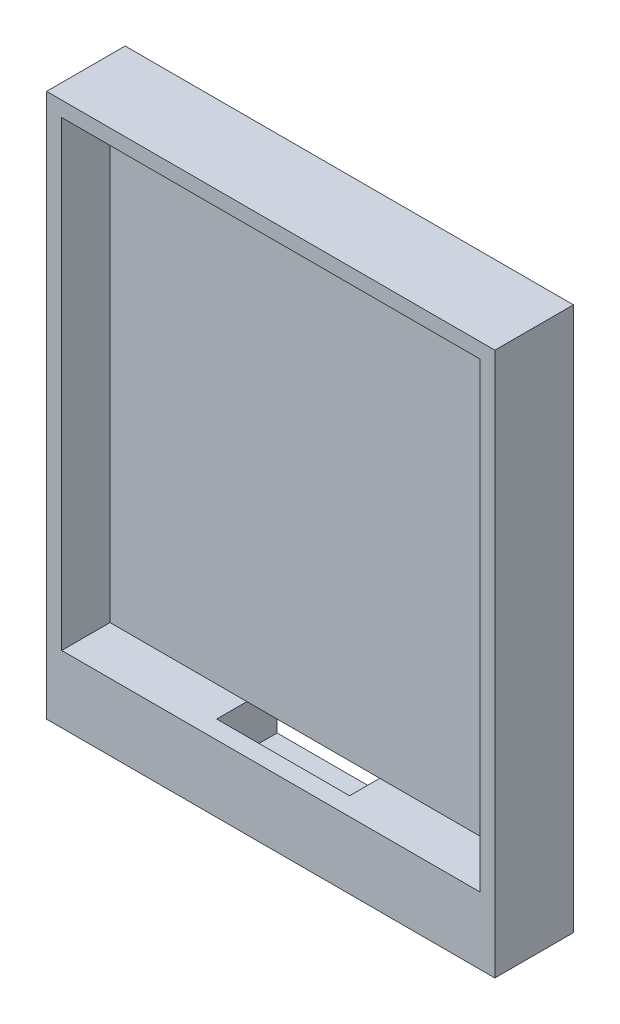
ISO-10303-21;
HEADER;
FILE_DESCRIPTION(('STEP AP214'),'2;1');
FILE_NAME('part.step','',(''),(''),'','','');
FILE_SCHEMA(('AUTOMOTIVE_DESIGN { 1 0 10303 214 1 1 1 1 }'));
ENDSEC;
DATA;
#1=APPLICATION_CONTEXT('core data for automotive mechanical design processes');
#2=APPLICATION_PROTOCOL_DEFINITION('international standard','automotive_design',2000,#1);
#3=PRODUCT_CONTEXT('',#1,'mechanical');
#4=PRODUCT('Part','Part','',(#3));
#5=PRODUCT_RELATED_PRODUCT_CATEGORY('part','',(#4));
#6=PRODUCT_DEFINITION_FORMATION('','',#4);
#7=PRODUCT_DEFINITION_CONTEXT('part definition',#1,'design');
#8=PRODUCT_DEFINITION('design','',#6,#7);
#9=PRODUCT_DEFINITION_SHAPE('','',#8);
#10=(LENGTH_UNIT() NAMED_UNIT(*) SI_UNIT(.MILLI.,.METRE.));
#11=(NAMED_UNIT(*) PLANE_ANGLE_UNIT() SI_UNIT($,.RADIAN.));
#12=(NAMED_UNIT(*) SI_UNIT($,.STERADIAN.) SOLID_ANGLE_UNIT());
#13=UNCERTAINTY_MEASURE_WITH_UNIT(LENGTH_MEASURE(1.E-05),#10,'distance_accuracy_value','');
#14=(GEOMETRIC_REPRESENTATION_CONTEXT(3) GLOBAL_UNCERTAINTY_ASSIGNED_CONTEXT((#13)) GLOBAL_UNIT_ASSIGNED_CONTEXT((#10,
#11,#12)) REPRESENTATION_CONTEXT('',''));
#15=CARTESIAN_POINT('',(0.,0.,0.));
#16=DIRECTION('',(0.,0.,1.));
#17=DIRECTION('',(1.,0.,0.));
#18=AXIS2_PLACEMENT_3D('',#15,#16,#17);
#19=CARTESIAN_POINT('',(0.,0.,0.));
#20=DIRECTION('',(0.,0.,-1.));
#21=DIRECTION('',(-1.,0.,0.));
#22=AXIS2_PLACEMENT_3D('',#19,#20,#21);
#23=PLANE('',#22);
#24=DIRECTION('',(1.,0.,0.));
#25=VECTOR('',#24,1.);
#26=CARTESIAN_POINT('',(-11.,-52.6084033613445,0.));
#27=LINE('',#26,#25);
#28=CARTESIAN_POINT('',(-11.,-52.6084033613445,0.));
#29=VERTEX_POINT('',#28);
#30=CARTESIAN_POINT('',(11.,-52.6084033613445,0.));
#31=VERTEX_POINT('',#30);
#32=EDGE_CURVE('E180',#29,#31,#27,.T.);
#33=ORIENTED_EDGE('',*,*,#32,.F.);
#34=DIRECTION('',(0.,1.,0.));
#35=VECTOR('',#34,1.);
#36=CARTESIAN_POINT('',(-11.,-53.6084033613445,0.));
#37=LINE('',#36,#35);
#38=CARTESIAN_POINT('',(-11.,-53.6084033613445,0.));
#39=VERTEX_POINT('',#38);
#40=EDGE_CURVE('E160',#39,#29,#37,.T.);
#41=ORIENTED_EDGE('',*,*,#40,.F.);
#42=DIRECTION('',(-1.,0.,0.));
#43=VECTOR('',#42,1.);
#44=CARTESIAN_POINT('',(11.,-53.6084033613445,0.));
#45=LINE('',#44,#43);
#46=CARTESIAN_POINT('',(11.,-53.6084033613445,0.));
#47=VERTEX_POINT('',#46);
#48=EDGE_CURVE('E210',#47,#39,#45,.T.);
#49=ORIENTED_EDGE('',*,*,#48,.F.);
#50=DIRECTION('',(0.,1.,0.));
#51=VECTOR('',#50,1.);
#52=CARTESIAN_POINT('',(11.,-53.6084033613445,0.));
#53=LINE('',#52,#51);
#54=EDGE_CURVE('E227',#47,#31,#53,.T.);
#55=ORIENTED_EDGE('',*,*,#54,.T.);
#56=EDGE_LOOP('',(#33,#41,#49,#55));
#57=FACE_BOUND('',#56,.T.);
#58=ADVANCED_FACE('F44',(#57),#23,.F.);
#59=DIRECTION('',(-1.,0.,0.));
#60=VECTOR('',#59,1.);
#61=CARTESIAN_POINT('',(-11.,-45.6084033613445,0.));
#62=LINE('',#61,#60);
#63=CARTESIAN_POINT('',(11.,-45.6084033613445,0.));
#64=VERTEX_POINT('',#63);
#65=CARTESIAN_POINT('',(-11.,-45.6084033613445,0.));
#66=VERTEX_POINT('',#65);
#67=EDGE_CURVE('E177',#64,#66,#62,.T.);
#68=ORIENTED_EDGE('',*,*,#67,.F.);
#69=DIRECTION('',(1.,0.,0.));
#70=VECTOR('',#69,1.);
#71=CARTESIAN_POINT('',(-33.6550420168067,-45.6084033613445,0.));
#72=LINE('',#71,#70);
#73=CARTESIAN_POINT('',(35.5449579831933,-45.6084033613445,0.));
#74=VERTEX_POINT('',#73);
#75=EDGE_CURVE('E270',#64,#74,#72,.T.);
#76=ORIENTED_EDGE('',*,*,#75,.T.);
#77=DIRECTION('',(0.,1.,0.));
#78=VECTOR('',#77,1.);
#79=CARTESIAN_POINT('',(35.5449579831933,30.7915966386555,0.));
#80=LINE('',#79,#78);
#81=CARTESIAN_POINT('',(35.5449579831933,30.7915966386555,0.));
#82=VERTEX_POINT('',#81);
#83=EDGE_CURVE('E275',#74,#82,#80,.T.);
#84=ORIENTED_EDGE('',*,*,#83,.T.);
#85=DIRECTION('',(-1.,0.,0.));
#86=VECTOR('',#85,1.);
#87=CARTESIAN_POINT('',(-33.6550420168067,30.7915966386555,0.));
#88=LINE('',#87,#86);
#89=CARTESIAN_POINT('',(-33.6550420168067,30.7915966386555,0.));
#90=VERTEX_POINT('',#89);
#91=EDGE_CURVE('E256',#82,#90,#88,.T.);
#92=ORIENTED_EDGE('',*,*,#91,.T.);
#93=DIRECTION('',(0.,-1.,0.));
#94=VECTOR('',#93,1.);
#95=CARTESIAN_POINT('',(-33.6550420168067,30.7915966386555,0.));
#96=LINE('',#95,#94);
#97=CARTESIAN_POINT('',(-33.6550420168067,-45.6084033613445,0.));
#98=VERTEX_POINT('',#97);
#99=EDGE_CURVE('E251',#90,#98,#96,.T.);
#100=ORIENTED_EDGE('',*,*,#99,.T.);
#101=EDGE_CURVE('E271',#98,#66,#72,.T.);
#102=ORIENTED_EDGE('',*,*,#101,.T.);
#103=EDGE_LOOP('',(#68,#76,#84,#92,#100,#102));
#104=FACE_BOUND('',#103,.T.);
#105=ADVANCED_FACE('F340',(#104),#23,.F.);
#106=CARTESIAN_POINT('',(0.,0.,8.));
#107=DIRECTION('',(0.,0.,1.));
#108=DIRECTION('',(1.,0.,0.));
#109=AXIS2_PLACEMENT_3D('',#106,#107,#108);
#110=PLANE('',#109);
#111=DIRECTION('',(0.,-1.,0.));
#112=VECTOR('',#111,1.);
#113=CARTESIAN_POINT('',(-36.1550420168067,33.2915966386555,8.));
#114=LINE('',#113,#112);
#115=CARTESIAN_POINT('',(-36.1550420168067,33.2915966386555,8.));
#116=VERTEX_POINT('',#115);
#117=CARTESIAN_POINT('',(-36.1550420168067,-56.7084033613445,8.));
#118=VERTEX_POINT('',#117);
#119=EDGE_CURVE('E295',#116,#118,#114,.T.);
#120=ORIENTED_EDGE('',*,*,#119,.T.);
#121=DIRECTION('',(1.,0.,0.));
#122=VECTOR('',#121,1.);
#123=CARTESIAN_POINT('',(-36.1550420168067,-56.7084033613445,8.));
#124=LINE('',#123,#122);
#125=CARTESIAN_POINT('',(38.0449579831933,-56.7084033613445,8.));
#126=VERTEX_POINT('',#125);
#127=EDGE_CURVE('E299',#118,#126,#124,.T.);
#128=ORIENTED_EDGE('',*,*,#127,.T.);
#129=DIRECTION('',(0.,1.,0.));
#130=VECTOR('',#129,1.);
#131=CARTESIAN_POINT('',(38.0449579831933,33.2915966386555,8.));
#132=LINE('',#131,#130);
#133=CARTESIAN_POINT('',(38.0449579831933,33.2915966386555,8.));
#134=VERTEX_POINT('',#133);
#135=EDGE_CURVE('E302',#126,#134,#132,.T.);
#136=ORIENTED_EDGE('',*,*,#135,.T.);
#137=DIRECTION('',(-1.,0.,0.));
#138=VECTOR('',#137,1.);
#139=CARTESIAN_POINT('',(-36.1550420168067,33.2915966386555,8.));
#140=LINE('',#139,#138);
#141=EDGE_CURVE('E305',#134,#116,#140,.T.);
#142=ORIENTED_EDGE('',*,*,#141,.T.);
#143=EDGE_LOOP('',(#120,#128,#136,#142));
#144=FACE_BOUND('',#143,.T.);
#145=DIRECTION('',(1.,0.,0.));
#146=VECTOR('',#145,1.);
#147=CARTESIAN_POINT('',(-33.6550420168067,-45.6084033613445,8.));
#148=LINE('',#147,#146);
#149=CARTESIAN_POINT('',(-33.6550420168067,-45.6084033613445,8.));
#150=VERTEX_POINT('',#149);
#151=CARTESIAN_POINT('',(35.5449579831933,-45.6084033613445,8.));
#152=VERTEX_POINT('',#151);
#153=EDGE_CURVE('E255',#150,#152,#148,.T.);
#154=ORIENTED_EDGE('',*,*,#153,.F.);
#155=DIRECTION('',(0.,-1.,0.));
#156=VECTOR('',#155,1.);
#157=CARTESIAN_POINT('',(-33.6550420168067,30.7915966386555,8.));
#158=LINE('',#157,#156);
#159=CARTESIAN_POINT('',(-33.6550420168067,30.7915966386555,8.));
#160=VERTEX_POINT('',#159);
#161=EDGE_CURVE('E252',#160,#150,#158,.T.);
#162=ORIENTED_EDGE('',*,*,#161,.F.);
#163=DIRECTION('',(-1.,0.,0.));
#164=VECTOR('',#163,1.);
#165=CARTESIAN_POINT('',(-33.6550420168067,30.7915966386555,8.));
#166=LINE('',#165,#164);
#167=CARTESIAN_POINT('',(35.5449579831933,30.7915966386555,8.));
#168=VERTEX_POINT('',#167);
#169=EDGE_CURVE('E263',#168,#160,#166,.T.);
#170=ORIENTED_EDGE('',*,*,#169,.F.);
#171=DIRECTION('',(0.,1.,0.));
#172=VECTOR('',#171,1.);
#173=CARTESIAN_POINT('',(35.5449579831933,30.7915966386555,8.));
#174=LINE('',#173,#172);
#175=EDGE_CURVE('E259',#152,#168,#174,.T.);
#176=ORIENTED_EDGE('',*,*,#175,.F.);
#177=EDGE_LOOP('',(#154,#162,#170,#176));
#178=FACE_BOUND('',#177,.T.);
#179=ADVANCED_FACE('F332',(#144,#178),#110,.T.);
#180=CARTESIAN_POINT('',(-36.1550420168067,33.2915966386555,8.));
#181=DIRECTION('',(1.,0.,0.));
#182=DIRECTION('',(0.,1.,0.));
#183=AXIS2_PLACEMENT_3D('',#180,#181,#182);
#184=PLANE('',#183);
#185=DIRECTION('',(0.,0.,-1.));
#186=VECTOR('',#185,1.);
#187=CARTESIAN_POINT('',(-36.1550420168067,33.2915966386555,8.));
#188=LINE('',#187,#186);
#189=CARTESIAN_POINT('',(-36.1550420168067,33.2915966386555,-5.));
#190=VERTEX_POINT('',#189);
#191=EDGE_CURVE('E308',#116,#190,#188,.T.);
#192=ORIENTED_EDGE('',*,*,#191,.T.);
#193=DIRECTION('',(0.,1.,0.));
#194=VECTOR('',#193,1.);
#195=CARTESIAN_POINT('',(-36.1550420168067,33.2915966386555,-5.));
#196=LINE('',#195,#194);
#197=CARTESIAN_POINT('',(-36.1550420168067,-56.7084033613445,-5.));
#198=VERTEX_POINT('',#197);
#199=EDGE_CURVE('E243',#198,#190,#196,.T.);
#200=ORIENTED_EDGE('',*,*,#199,.F.);
#201=DIRECTION('',(0.,0.,-1.));
#202=VECTOR('',#201,1.);
#203=CARTESIAN_POINT('',(-36.1550420168067,-56.7084033613445,8.));
#204=LINE('',#203,#202);
#205=EDGE_CURVE('E11',#118,#198,#204,.T.);
#206=ORIENTED_EDGE('',*,*,#205,.F.);
#207=ORIENTED_EDGE('',*,*,#119,.F.);
#208=EDGE_LOOP('',(#192,#200,#206,#207));
#209=FACE_BOUND('',#208,.T.);
#210=ADVANCED_FACE('F46',(#209),#184,.F.);
#211=CARTESIAN_POINT('',(-36.1550420168067,-56.7084033613445,8.));
#212=DIRECTION('',(0.,1.,0.));
#213=DIRECTION('',(0.,0.,1.));
#214=AXIS2_PLACEMENT_3D('',#211,#212,#213);
#215=PLANE('',#214);
#216=ORIENTED_EDGE('',*,*,#205,.T.);
#217=DIRECTION('',(-1.,0.,0.));
#218=VECTOR('',#217,1.);
#219=CARTESIAN_POINT('',(38.0449579831933,-56.7084033613445,-5.));
#220=LINE('',#219,#218);
#221=CARTESIAN_POINT('',(38.0449579831933,-56.7084033613445,-5.));
#222=VERTEX_POINT('',#221);
#223=EDGE_CURVE('E239',#222,#198,#220,.T.);
#224=ORIENTED_EDGE('',*,*,#223,.F.);
#225=DIRECTION('',(0.,0.,-1.));
#226=VECTOR('',#225,1.);
#227=CARTESIAN_POINT('',(38.0449579831933,-56.7084033613445,8.));
#228=LINE('',#227,#226);
#229=EDGE_CURVE('E53',#126,#222,#228,.T.);
#230=ORIENTED_EDGE('',*,*,#229,.F.);
#231=ORIENTED_EDGE('',*,*,#127,.F.);
#232=EDGE_LOOP('',(#216,#224,#230,#231));
#233=FACE_BOUND('',#232,.T.);
#234=ADVANCED_FACE('F322',(#233),#215,.F.);
#235=CARTESIAN_POINT('',(38.0449579831933,33.2915966386555,8.));
#236=DIRECTION('',(-1.,0.,0.));
#237=DIRECTION('',(0.,-1.,0.));
#238=AXIS2_PLACEMENT_3D('',#235,#236,#237);
#239=PLANE('',#238);
#240=ORIENTED_EDGE('',*,*,#229,.T.);
#241=DIRECTION('',(0.,-1.,0.));
#242=VECTOR('',#241,1.);
#243=CARTESIAN_POINT('',(38.0449579831933,33.2915966386555,-5.));
#244=LINE('',#243,#242);
#245=CARTESIAN_POINT('',(38.0449579831933,33.2915966386555,-5.));
#246=VERTEX_POINT('',#245);
#247=EDGE_CURVE('E226',#246,#222,#244,.T.);
#248=ORIENTED_EDGE('',*,*,#247,.F.);
#249=DIRECTION('',(0.,0.,-1.));
#250=VECTOR('',#249,1.);
#251=CARTESIAN_POINT('',(38.0449579831933,33.2915966386555,8.));
#252=LINE('',#251,#250);
#253=EDGE_CURVE('E311',#134,#246,#252,.T.);
#254=ORIENTED_EDGE('',*,*,#253,.F.);
#255=ORIENTED_EDGE('',*,*,#135,.F.);
#256=EDGE_LOOP('',(#240,#248,#254,#255));
#257=FACE_BOUND('',#256,.T.);
#258=ADVANCED_FACE('F319',(#257),#239,.F.);
#259=CARTESIAN_POINT('',(-36.1550420168067,33.2915966386555,8.));
#260=DIRECTION('',(0.,-1.,0.));
#261=DIRECTION('',(0.,0.,-1.));
#262=AXIS2_PLACEMENT_3D('',#259,#260,#261);
#263=PLANE('',#262);
#264=ORIENTED_EDGE('',*,*,#253,.T.);
#265=DIRECTION('',(1.,0.,0.));
#266=VECTOR('',#265,1.);
#267=CARTESIAN_POINT('',(38.0449579831933,33.2915966386555,-5.));
#268=LINE('',#267,#266);
#269=EDGE_CURVE('E247',#190,#246,#268,.T.);
#270=ORIENTED_EDGE('',*,*,#269,.F.);
#271=ORIENTED_EDGE('',*,*,#191,.F.);
#272=ORIENTED_EDGE('',*,*,#141,.F.);
#273=EDGE_LOOP('',(#264,#270,#271,#272));
#274=FACE_BOUND('',#273,.T.);
#275=ADVANCED_FACE('F328',(#274),#263,.F.);
#276=CARTESIAN_POINT('',(-33.6550420168067,30.7915966386555,8.));
#277=DIRECTION('',(1.,0.,0.));
#278=DIRECTION('',(0.,1.,0.));
#279=AXIS2_PLACEMENT_3D('',#276,#277,#278);
#280=PLANE('',#279);
#281=ORIENTED_EDGE('',*,*,#99,.F.);
#282=DIRECTION('',(0.,0.,-1.));
#283=VECTOR('',#282,1.);
#284=CARTESIAN_POINT('',(-33.6550420168067,30.7915966386555,8.));
#285=LINE('',#284,#283);
#286=EDGE_CURVE('E266',#160,#90,#285,.T.);
#287=ORIENTED_EDGE('',*,*,#286,.F.);
#288=ORIENTED_EDGE('',*,*,#161,.T.);
#289=DIRECTION('',(0.,0.,-1.));
#290=VECTOR('',#289,1.);
#291=CARTESIAN_POINT('',(-33.6550420168067,-45.6084033613445,8.));
#292=LINE('',#291,#290);
#293=EDGE_CURVE('E291',#150,#98,#292,.T.);
#294=ORIENTED_EDGE('',*,*,#293,.T.);
#295=EDGE_LOOP('',(#281,#287,#288,#294));
#296=FACE_BOUND('',#295,.T.);
#297=ADVANCED_FACE('F364',(#296),#280,.T.);
#298=CARTESIAN_POINT('',(-33.6550420168067,-45.6084033613445,8.));
#299=DIRECTION('',(0.,1.,0.));
#300=DIRECTION('',(-1.,0.,0.));
#301=AXIS2_PLACEMENT_3D('',#298,#299,#300);
#302=PLANE('',#301);
#303=DIRECTION('',(0.,0.,1.));
#304=VECTOR('',#303,1.);
#305=CARTESIAN_POINT('',(-11.,-45.6084033613445,0.));
#306=LINE('',#305,#304);
#307=CARTESIAN_POINT('',(-11.,-45.6084033613445,5.));
#308=VERTEX_POINT('',#307);
#309=EDGE_CURVE('E192',#66,#308,#306,.T.);
#310=ORIENTED_EDGE('',*,*,#309,.F.);
#311=ORIENTED_EDGE('',*,*,#101,.F.);
#312=ORIENTED_EDGE('',*,*,#293,.F.);
#313=ORIENTED_EDGE('',*,*,#153,.T.);
#314=DIRECTION('',(0.,0.,-1.));
#315=VECTOR('',#314,1.);
#316=CARTESIAN_POINT('',(35.5449579831933,-45.6084033613445,8.));
#317=LINE('',#316,#315);
#318=EDGE_CURVE('E287',#152,#74,#317,.T.);
#319=ORIENTED_EDGE('',*,*,#318,.T.);
#320=ORIENTED_EDGE('',*,*,#75,.F.);
#321=DIRECTION('',(0.,0.,-1.));
#322=VECTOR('',#321,1.);
#323=CARTESIAN_POINT('',(11.,-45.6084033613445,0.));
#324=LINE('',#323,#322);
#325=CARTESIAN_POINT('',(11.,-45.6084033613445,5.));
#326=VERTEX_POINT('',#325);
#327=EDGE_CURVE('E202',#326,#64,#324,.T.);
#328=ORIENTED_EDGE('',*,*,#327,.F.);
#329=DIRECTION('',(1.,0.,0.));
#330=VECTOR('',#329,1.);
#331=CARTESIAN_POINT('',(11.,-45.6084033613445,5.));
#332=LINE('',#331,#330);
#333=EDGE_CURVE('E217',#308,#326,#332,.T.);
#334=ORIENTED_EDGE('',*,*,#333,.F.);
#335=EDGE_LOOP('',(#310,#311,#312,#313,#319,#320,#328,#334));
#336=FACE_BOUND('',#335,.T.);
#337=ADVANCED_FACE('F360',(#336),#302,.T.);
#338=CARTESIAN_POINT('',(35.5449579831933,30.7915966386555,8.));
#339=DIRECTION('',(-1.,0.,0.));
#340=DIRECTION('',(0.,0.,1.));
#341=AXIS2_PLACEMENT_3D('',#338,#339,#340);
#342=PLANE('',#341);
#343=ORIENTED_EDGE('',*,*,#83,.F.);
#344=ORIENTED_EDGE('',*,*,#318,.F.);
#345=ORIENTED_EDGE('',*,*,#175,.T.);
#346=DIRECTION('',(0.,0.,-1.));
#347=VECTOR('',#346,1.);
#348=CARTESIAN_POINT('',(35.5449579831933,30.7915966386555,8.));
#349=LINE('',#348,#347);
#350=EDGE_CURVE('E284',#168,#82,#349,.T.);
#351=ORIENTED_EDGE('',*,*,#350,.T.);
#352=EDGE_LOOP('',(#343,#344,#345,#351));
#353=FACE_BOUND('',#352,.T.);
#354=ADVANCED_FACE('F356',(#353),#342,.T.);
#355=CARTESIAN_POINT('',(-33.6550420168067,30.7915966386555,8.));
#356=DIRECTION('',(0.,-1.,0.));
#357=DIRECTION('',(0.,0.,-1.));
#358=AXIS2_PLACEMENT_3D('',#355,#356,#357);
#359=PLANE('',#358);
#360=ORIENTED_EDGE('',*,*,#91,.F.);
#361=ORIENTED_EDGE('',*,*,#350,.F.);
#362=ORIENTED_EDGE('',*,*,#169,.T.);
#363=ORIENTED_EDGE('',*,*,#286,.T.);
#364=EDGE_LOOP('',(#360,#361,#362,#363));
#365=FACE_BOUND('',#364,.T.);
#366=ADVANCED_FACE('F353',(#365),#359,.T.);
#367=CARTESIAN_POINT('',(0.,0.,-5.));
#368=DIRECTION('',(0.,0.,-1.));
#369=DIRECTION('',(-1.,0.,0.));
#370=AXIS2_PLACEMENT_3D('',#367,#368,#369);
#371=PLANE('',#370);
#372=DIRECTION('',(0.,-1.,0.));
#373=VECTOR('',#372,1.);
#374=CARTESIAN_POINT('',(-11.,-45.6084033613445,-5.));
#375=LINE('',#374,#373);
#376=CARTESIAN_POINT('',(-11.,-45.6084033613445,-5.));
#377=VERTEX_POINT('',#376);
#378=CARTESIAN_POINT('',(-11.,-52.6084033613445,-5.));
#379=VERTEX_POINT('',#378);
#380=EDGE_CURVE('E157',#377,#379,#375,.T.);
#381=ORIENTED_EDGE('',*,*,#380,.T.);
#382=DIRECTION('',(1.,0.,0.));
#383=VECTOR('',#382,1.);
#384=CARTESIAN_POINT('',(-11.,-52.6084033613445,-5.));
#385=LINE('',#384,#383);
#386=CARTESIAN_POINT('',(11.,-52.6084033613445,-5.));
#387=VERTEX_POINT('',#386);
#388=EDGE_CURVE('E169',#379,#387,#385,.T.);
#389=ORIENTED_EDGE('',*,*,#388,.T.);
#390=DIRECTION('',(0.,1.,0.));
#391=VECTOR('',#390,1.);
#392=CARTESIAN_POINT('',(11.,-45.6084033613445,-5.));
#393=LINE('',#392,#391);
#394=CARTESIAN_POINT('',(11.,-45.6084033613445,-5.));
#395=VERTEX_POINT('',#394);
#396=EDGE_CURVE('E60',#387,#395,#393,.T.);
#397=ORIENTED_EDGE('',*,*,#396,.T.);
#398=DIRECTION('',(-1.,0.,0.));
#399=VECTOR('',#398,1.);
#400=CARTESIAN_POINT('',(-11.,-45.6084033613445,-5.));
#401=LINE('',#400,#399);
#402=EDGE_CURVE('E166',#395,#377,#401,.T.);
#403=ORIENTED_EDGE('',*,*,#402,.T.);
#404=EDGE_LOOP('',(#381,#389,#397,#403));
#405=FACE_BOUND('',#404,.T.);
#406=ORIENTED_EDGE('',*,*,#247,.T.);
#407=ORIENTED_EDGE('',*,*,#223,.T.);
#408=ORIENTED_EDGE('',*,*,#199,.T.);
#409=ORIENTED_EDGE('',*,*,#269,.T.);
#410=EDGE_LOOP('',(#406,#407,#408,#409));
#411=FACE_BOUND('',#410,.T.);
#412=ADVANCED_FACE('F174',(#405,#411),#371,.T.);
#413=CARTESIAN_POINT('',(-11.,-53.6084033613445,0.));
#414=DIRECTION('',(-1.,0.,0.));
#415=DIRECTION('',(0.,-1.,0.));
#416=AXIS2_PLACEMENT_3D('',#413,#414,#415);
#417=PLANE('',#416);
#418=ORIENTED_EDGE('',*,*,#309,.T.);
#419=DIRECTION('',(0.,1.,0.));
#420=VECTOR('',#419,1.);
#421=CARTESIAN_POINT('',(-11.,-53.6084033613445,5.));
#422=LINE('',#421,#420);
#423=CARTESIAN_POINT('',(-11.,-53.6084033613445,5.));
#424=VERTEX_POINT('',#423);
#425=EDGE_CURVE('E214',#424,#308,#422,.T.);
#426=ORIENTED_EDGE('',*,*,#425,.F.);
#427=DIRECTION('',(0.,0.,1.));
#428=VECTOR('',#427,1.);
#429=CARTESIAN_POINT('',(-11.,-53.6084033613445,0.));
#430=LINE('',#429,#428);
#431=EDGE_CURVE('E197',#39,#424,#430,.T.);
#432=ORIENTED_EDGE('',*,*,#431,.F.);
#433=ORIENTED_EDGE('',*,*,#40,.T.);
#434=DIRECTION('',(0.,0.,1.));
#435=VECTOR('',#434,1.);
#436=CARTESIAN_POINT('',(-11.,-52.6084033613445,-5.));
#437=LINE('',#436,#435);
#438=EDGE_CURVE('E152',#379,#29,#437,.T.);
#439=ORIENTED_EDGE('',*,*,#438,.F.);
#440=ORIENTED_EDGE('',*,*,#380,.F.);
#441=DIRECTION('',(0.,0.,1.));
#442=VECTOR('',#441,1.);
#443=CARTESIAN_POINT('',(-11.,-45.6084033613445,-5.));
#444=LINE('',#443,#442);
#445=EDGE_CURVE('E189',#377,#66,#444,.T.);
#446=ORIENTED_EDGE('',*,*,#445,.T.);
#447=EDGE_LOOP('',(#418,#426,#432,#433,#439,#440,#446));
#448=FACE_BOUND('',#447,.T.);
#449=ADVANCED_FACE('F155',(#448),#417,.F.);
#450=CARTESIAN_POINT('',(11.,-53.6084033613445,0.));
#451=DIRECTION('',(1.,0.,0.));
#452=DIRECTION('',(0.,1.,0.));
#453=AXIS2_PLACEMENT_3D('',#450,#451,#452);
#454=PLANE('',#453);
#455=ORIENTED_EDGE('',*,*,#327,.T.);
#456=DIRECTION('',(0.,0.,1.));
#457=VECTOR('',#456,1.);
#458=CARTESIAN_POINT('',(11.,-45.6084033613445,-5.));
#459=LINE('',#458,#457);
#460=EDGE_CURVE('E67',#395,#64,#459,.T.);
#461=ORIENTED_EDGE('',*,*,#460,.F.);
#462=ORIENTED_EDGE('',*,*,#396,.F.);
#463=DIRECTION('',(0.,0.,1.));
#464=VECTOR('',#463,1.);
#465=CARTESIAN_POINT('',(11.,-52.6084033613445,-5.));
#466=LINE('',#465,#464);
#467=EDGE_CURVE('E165',#387,#31,#466,.T.);
#468=ORIENTED_EDGE('',*,*,#467,.T.);
#469=ORIENTED_EDGE('',*,*,#54,.F.);
#470=DIRECTION('',(0.,0.,-1.));
#471=VECTOR('',#470,1.);
#472=CARTESIAN_POINT('',(11.,-53.6084033613445,0.));
#473=LINE('',#472,#471);
#474=CARTESIAN_POINT('',(11.,-53.6084033613445,5.));
#475=VERTEX_POINT('',#474);
#476=EDGE_CURVE('E206',#475,#47,#473,.T.);
#477=ORIENTED_EDGE('',*,*,#476,.F.);
#478=DIRECTION('',(0.,1.,0.));
#479=VECTOR('',#478,1.);
#480=CARTESIAN_POINT('',(11.,-53.6084033613445,5.));
#481=LINE('',#480,#479);
#482=EDGE_CURVE('E231',#475,#326,#481,.T.);
#483=ORIENTED_EDGE('',*,*,#482,.T.);
#484=EDGE_LOOP('',(#455,#461,#462,#468,#469,#477,#483));
#485=FACE_BOUND('',#484,.T.);
#486=ADVANCED_FACE('F406',(#485),#454,.F.);
#487=CARTESIAN_POINT('',(11.,-53.6084033613445,5.));
#488=DIRECTION('',(0.,0.,1.));
#489=DIRECTION('',(1.,0.,0.));
#490=AXIS2_PLACEMENT_3D('',#487,#488,#489);
#491=PLANE('',#490);
#492=ORIENTED_EDGE('',*,*,#333,.T.);
#493=ORIENTED_EDGE('',*,*,#482,.F.);
#494=DIRECTION('',(1.,0.,0.));
#495=VECTOR('',#494,1.);
#496=CARTESIAN_POINT('',(11.,-53.6084033613445,5.));
#497=LINE('',#496,#495);
#498=EDGE_CURVE('E201',#424,#475,#497,.T.);
#499=ORIENTED_EDGE('',*,*,#498,.F.);
#500=ORIENTED_EDGE('',*,*,#425,.T.);
#501=EDGE_LOOP('',(#492,#493,#499,#500));
#502=FACE_BOUND('',#501,.T.);
#503=ADVANCED_FACE('F402',(#502),#491,.F.);
#504=CARTESIAN_POINT('',(0.,-53.6084033613445,0.));
#505=DIRECTION('',(0.,-1.,0.));
#506=DIRECTION('',(0.,0.,-1.));
#507=AXIS2_PLACEMENT_3D('',#504,#505,#506);
#508=PLANE('',#507);
#509=ORIENTED_EDGE('',*,*,#431,.T.);
#510=ORIENTED_EDGE('',*,*,#498,.T.);
#511=ORIENTED_EDGE('',*,*,#476,.T.);
#512=ORIENTED_EDGE('',*,*,#48,.T.);
#513=EDGE_LOOP('',(#509,#510,#511,#512));
#514=FACE_BOUND('',#513,.T.);
#515=ADVANCED_FACE('F405',(#514),#508,.F.);
#516=CARTESIAN_POINT('',(-11.,-45.6084033613445,-5.));
#517=DIRECTION('',(0.,1.,0.));
#518=DIRECTION('',(0.,0.,1.));
#519=AXIS2_PLACEMENT_3D('',#516,#517,#518);
#520=PLANE('',#519);
#521=ORIENTED_EDGE('',*,*,#67,.T.);
#522=ORIENTED_EDGE('',*,*,#445,.F.);
#523=ORIENTED_EDGE('',*,*,#402,.F.);
#524=ORIENTED_EDGE('',*,*,#460,.T.);
#525=EDGE_LOOP('',(#521,#522,#523,#524));
#526=FACE_BOUND('',#525,.T.);
#527=ADVANCED_FACE('F415',(#526),#520,.F.);
#528=CARTESIAN_POINT('',(-11.,-52.6084033613445,-5.));
#529=DIRECTION('',(0.,-1.,0.));
#530=DIRECTION('',(0.,0.,-1.));
#531=AXIS2_PLACEMENT_3D('',#528,#529,#530);
#532=PLANE('',#531);
#533=ORIENTED_EDGE('',*,*,#32,.T.);
#534=ORIENTED_EDGE('',*,*,#467,.F.);
#535=ORIENTED_EDGE('',*,*,#388,.F.);
#536=ORIENTED_EDGE('',*,*,#438,.T.);
#537=EDGE_LOOP('',(#533,#534,#535,#536));
#538=FACE_BOUND('',#537,.T.);
#539=ADVANCED_FACE('F170',(#538),#532,.F.);
#540=CLOSED_SHELL('',(#58,#105,#179,#210,#234,#258,#275,#297,#337,#354,#366,#412,#449,#486,#503,
#515,#527,#539));
#541=MANIFOLD_SOLID_BREP('B2',#540);
#542=ADVANCED_BREP_SHAPE_REPRESENTATION('',(#18,#541),#14);
#543=SHAPE_DEFINITION_REPRESENTATION(#9,#542);
ENDSEC;
END-ISO-10303-21;
